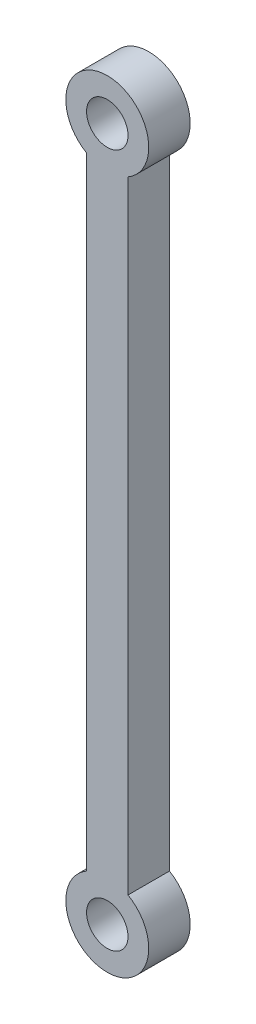
ISO-10303-21;
HEADER;
FILE_DESCRIPTION(('STEP AP214'),'2;1');
FILE_NAME('part.step','',(''),(''),'','','');
FILE_SCHEMA(('AUTOMOTIVE_DESIGN { 1 0 10303 214 1 1 1 1 }'));
ENDSEC;
DATA;
#1=APPLICATION_CONTEXT('core data for automotive mechanical design processes');
#2=APPLICATION_PROTOCOL_DEFINITION('international standard','automotive_design',2000,#1);
#3=PRODUCT_CONTEXT('',#1,'mechanical');
#4=PRODUCT('Part','Part','',(#3));
#5=PRODUCT_RELATED_PRODUCT_CATEGORY('part','',(#4));
#6=PRODUCT_DEFINITION_FORMATION('','',#4);
#7=PRODUCT_DEFINITION_CONTEXT('part definition',#1,'design');
#8=PRODUCT_DEFINITION('design','',#6,#7);
#9=PRODUCT_DEFINITION_SHAPE('','',#8);
#10=(LENGTH_UNIT() NAMED_UNIT(*) SI_UNIT(.MILLI.,.METRE.));
#11=(NAMED_UNIT(*) PLANE_ANGLE_UNIT() SI_UNIT($,.RADIAN.));
#12=(NAMED_UNIT(*) SI_UNIT($,.STERADIAN.) SOLID_ANGLE_UNIT());
#13=UNCERTAINTY_MEASURE_WITH_UNIT(LENGTH_MEASURE(1.E-05),#10,'distance_accuracy_value','');
#14=(GEOMETRIC_REPRESENTATION_CONTEXT(3) GLOBAL_UNCERTAINTY_ASSIGNED_CONTEXT((#13)) GLOBAL_UNIT_ASSIGNED_CONTEXT((#10,
#11,#12)) REPRESENTATION_CONTEXT('',''));
#15=CARTESIAN_POINT('',(0.,0.,0.));
#16=DIRECTION('',(0.,0.,1.));
#17=DIRECTION('',(1.,0.,0.));
#18=AXIS2_PLACEMENT_3D('',#15,#16,#17);
#19=CARTESIAN_POINT('',(1.,-1.73205080756888,2.));
#20=DIRECTION('',(0.,0.,1.));
#21=DIRECTION('',(1.,0.,0.));
#22=AXIS2_PLACEMENT_3D('',#19,#20,#21);
#23=PLANE('',#22);
#24=CARTESIAN_POINT('',(1.,31.7320508075689,2.));
#25=DIRECTION('',(0.,0.,1.));
#26=DIRECTION('',(1.,0.,0.));
#27=AXIS2_PLACEMENT_3D('',#24,#25,#26);
#28=CIRCLE('',#27,1.);
#29=CARTESIAN_POINT('',(2.,31.7320508075689,2.));
#30=VERTEX_POINT('',#29);
#31=EDGE_CURVE('E112',#30,#30,#28,.T.);
#32=ORIENTED_EDGE('',*,*,#31,.F.);
#33=EDGE_LOOP('',(#32));
#34=FACE_BOUND('',#33,.T.);
#35=CARTESIAN_POINT('',(1.,-1.73205080756888,2.));
#36=DIRECTION('',(0.,0.,1.));
#37=DIRECTION('',(1.,0.,0.));
#38=AXIS2_PLACEMENT_3D('',#35,#36,#37);
#39=CIRCLE('',#38,2.);
#40=CARTESIAN_POINT('',(0.,0.,2.));
#41=VERTEX_POINT('',#40);
#42=CARTESIAN_POINT('',(2.,0.,2.));
#43=VERTEX_POINT('',#42);
#44=EDGE_CURVE('E92',#41,#43,#39,.T.);
#45=ORIENTED_EDGE('',*,*,#44,.T.);
#46=DIRECTION('',(0.,1.,0.));
#47=VECTOR('',#46,1.);
#48=CARTESIAN_POINT('',(2.,30.,2.));
#49=LINE('',#48,#47);
#50=CARTESIAN_POINT('',(2.,30.,2.));
#51=VERTEX_POINT('',#50);
#52=EDGE_CURVE('E87',#43,#51,#49,.T.);
#53=ORIENTED_EDGE('',*,*,#52,.T.);
#54=CARTESIAN_POINT('',(1.,31.7320508075689,2.));
#55=DIRECTION('',(0.,0.,1.));
#56=DIRECTION('',(-1.,0.,0.));
#57=AXIS2_PLACEMENT_3D('',#54,#55,#56);
#58=CIRCLE('',#57,2.);
#59=CARTESIAN_POINT('',(0.,30.,2.));
#60=VERTEX_POINT('',#59);
#61=EDGE_CURVE('E90',#51,#60,#58,.T.);
#62=ORIENTED_EDGE('',*,*,#61,.T.);
#63=DIRECTION('',(0.,-1.,0.));
#64=VECTOR('',#63,1.);
#65=CARTESIAN_POINT('',(0.,0.,2.));
#66=LINE('',#65,#64);
#67=EDGE_CURVE('E57',#60,#41,#66,.T.);
#68=ORIENTED_EDGE('',*,*,#67,.T.);
#69=EDGE_LOOP('',(#45,#53,#62,#68));
#70=FACE_BOUND('',#69,.T.);
#71=CARTESIAN_POINT('',(1.,-1.73205080756888,2.));
#72=DIRECTION('',(0.,0.,1.));
#73=DIRECTION('',(1.,0.,0.));
#74=AXIS2_PLACEMENT_3D('',#71,#72,#73);
#75=CIRCLE('',#74,1.);
#76=CARTESIAN_POINT('',(2.,-1.73205080756888,2.));
#77=VERTEX_POINT('',#76);
#78=EDGE_CURVE('E134',#77,#77,#75,.T.);
#79=ORIENTED_EDGE('',*,*,#78,.F.);
#80=EDGE_LOOP('',(#79));
#81=FACE_BOUND('',#80,.T.);
#82=ADVANCED_FACE('F39',(#34,#70,#81),#23,.T.);
#83=CARTESIAN_POINT('',(1.,-1.73205080756888,0.));
#84=DIRECTION('',(0.,0.,1.));
#85=DIRECTION('',(1.,0.,0.));
#86=AXIS2_PLACEMENT_3D('',#83,#84,#85);
#87=PLANE('',#86);
#88=CARTESIAN_POINT('',(1.,-1.73205080756888,0.));
#89=DIRECTION('',(0.,0.,1.));
#90=DIRECTION('',(1.,0.,0.));
#91=AXIS2_PLACEMENT_3D('',#88,#89,#90);
#92=CIRCLE('',#91,2.);
#93=CARTESIAN_POINT('',(0.,0.,0.));
#94=VERTEX_POINT('',#93);
#95=CARTESIAN_POINT('',(2.,0.,0.));
#96=VERTEX_POINT('',#95);
#97=EDGE_CURVE('E108',#94,#96,#92,.T.);
#98=ORIENTED_EDGE('',*,*,#97,.F.);
#99=DIRECTION('',(0.,-1.,0.));
#100=VECTOR('',#99,1.);
#101=CARTESIAN_POINT('',(0.,0.,0.));
#102=LINE('',#101,#100);
#103=CARTESIAN_POINT('',(0.,30.,0.));
#104=VERTEX_POINT('',#103);
#105=EDGE_CURVE('E80',#104,#94,#102,.T.);
#106=ORIENTED_EDGE('',*,*,#105,.F.);
#107=CARTESIAN_POINT('',(1.,31.7320508075689,0.));
#108=DIRECTION('',(0.,0.,1.));
#109=DIRECTION('',(-1.,0.,0.));
#110=AXIS2_PLACEMENT_3D('',#107,#108,#109);
#111=CIRCLE('',#110,2.);
#112=CARTESIAN_POINT('',(2.,30.,0.));
#113=VERTEX_POINT('',#112);
#114=EDGE_CURVE('E74',#113,#104,#111,.T.);
#115=ORIENTED_EDGE('',*,*,#114,.F.);
#116=DIRECTION('',(0.,1.,0.));
#117=VECTOR('',#116,1.);
#118=CARTESIAN_POINT('',(2.,30.,0.));
#119=LINE('',#118,#117);
#120=EDGE_CURVE('E97',#96,#113,#119,.T.);
#121=ORIENTED_EDGE('',*,*,#120,.F.);
#122=EDGE_LOOP('',(#98,#106,#115,#121));
#123=FACE_BOUND('',#122,.T.);
#124=CARTESIAN_POINT('',(1.,31.7320508075689,0.));
#125=DIRECTION('',(0.,0.,1.));
#126=DIRECTION('',(1.,0.,0.));
#127=AXIS2_PLACEMENT_3D('',#124,#125,#126);
#128=CIRCLE('',#127,1.);
#129=CARTESIAN_POINT('',(2.,31.7320508075689,0.));
#130=VERTEX_POINT('',#129);
#131=EDGE_CURVE('E130',#130,#130,#128,.T.);
#132=ORIENTED_EDGE('',*,*,#131,.T.);
#133=EDGE_LOOP('',(#132));
#134=FACE_BOUND('',#133,.T.);
#135=CARTESIAN_POINT('',(1.,-1.73205080756888,0.));
#136=DIRECTION('',(0.,0.,1.));
#137=DIRECTION('',(1.,0.,0.));
#138=AXIS2_PLACEMENT_3D('',#135,#136,#137);
#139=CIRCLE('',#138,1.);
#140=CARTESIAN_POINT('',(2.,-1.73205080756888,0.));
#141=VERTEX_POINT('',#140);
#142=EDGE_CURVE('E138',#141,#141,#139,.T.);
#143=ORIENTED_EDGE('',*,*,#142,.T.);
#144=EDGE_LOOP('',(#143));
#145=FACE_BOUND('',#144,.T.);
#146=ADVANCED_FACE('F125',(#123,#134,#145),#87,.F.);
#147=CARTESIAN_POINT('',(1.,-1.73205080756888,2.));
#148=DIRECTION('',(0.,0.,-1.));
#149=DIRECTION('',(-1.,0.,0.));
#150=AXIS2_PLACEMENT_3D('',#147,#148,#149);
#151=CYLINDRICAL_SURFACE('',#150,2.);
#152=ORIENTED_EDGE('',*,*,#97,.T.);
#153=DIRECTION('',(0.,0.,-1.));
#154=VECTOR('',#153,1.);
#155=CARTESIAN_POINT('',(2.,0.,2.));
#156=LINE('',#155,#154);
#157=EDGE_CURVE('E11',#43,#96,#156,.T.);
#158=ORIENTED_EDGE('',*,*,#157,.F.);
#159=ORIENTED_EDGE('',*,*,#44,.F.);
#160=DIRECTION('',(0.,0.,-1.));
#161=VECTOR('',#160,1.);
#162=CARTESIAN_POINT('',(0.,0.,2.));
#163=LINE('',#162,#161);
#164=EDGE_CURVE('E104',#41,#94,#163,.T.);
#165=ORIENTED_EDGE('',*,*,#164,.T.);
#166=EDGE_LOOP('',(#152,#158,#159,#165));
#167=FACE_BOUND('',#166,.T.);
#168=ADVANCED_FACE('F41',(#167),#151,.T.);
#169=CARTESIAN_POINT('',(2.,30.,2.));
#170=DIRECTION('',(-1.,0.,0.));
#171=DIRECTION('',(0.,-1.,0.));
#172=AXIS2_PLACEMENT_3D('',#169,#170,#171);
#173=PLANE('',#172);
#174=ORIENTED_EDGE('',*,*,#120,.T.);
#175=DIRECTION('',(0.,0.,-1.));
#176=VECTOR('',#175,1.);
#177=CARTESIAN_POINT('',(2.,30.,2.));
#178=LINE('',#177,#176);
#179=EDGE_CURVE('E49',#51,#113,#178,.T.);
#180=ORIENTED_EDGE('',*,*,#179,.F.);
#181=ORIENTED_EDGE('',*,*,#52,.F.);
#182=ORIENTED_EDGE('',*,*,#157,.T.);
#183=EDGE_LOOP('',(#174,#180,#181,#182));
#184=FACE_BOUND('',#183,.T.);
#185=ADVANCED_FACE('F96',(#184),#173,.F.);
#186=CARTESIAN_POINT('',(1.,31.7320508075689,2.));
#187=DIRECTION('',(0.,0.,-1.));
#188=DIRECTION('',(-1.,0.,0.));
#189=AXIS2_PLACEMENT_3D('',#186,#187,#188);
#190=CYLINDRICAL_SURFACE('',#189,2.);
#191=ORIENTED_EDGE('',*,*,#114,.T.);
#192=DIRECTION('',(0.,0.,-1.));
#193=VECTOR('',#192,1.);
#194=CARTESIAN_POINT('',(0.,30.,2.));
#195=LINE('',#194,#193);
#196=EDGE_CURVE('E99',#60,#104,#195,.T.);
#197=ORIENTED_EDGE('',*,*,#196,.F.);
#198=ORIENTED_EDGE('',*,*,#61,.F.);
#199=ORIENTED_EDGE('',*,*,#179,.T.);
#200=EDGE_LOOP('',(#191,#197,#198,#199));
#201=FACE_BOUND('',#200,.T.);
#202=ADVANCED_FACE('F100',(#201),#190,.T.);
#203=CARTESIAN_POINT('',(0.,0.,2.));
#204=DIRECTION('',(1.,0.,0.));
#205=DIRECTION('',(0.,0.,-1.));
#206=AXIS2_PLACEMENT_3D('',#203,#204,#205);
#207=PLANE('',#206);
#208=ORIENTED_EDGE('',*,*,#105,.T.);
#209=ORIENTED_EDGE('',*,*,#164,.F.);
#210=ORIENTED_EDGE('',*,*,#67,.F.);
#211=ORIENTED_EDGE('',*,*,#196,.T.);
#212=EDGE_LOOP('',(#208,#209,#210,#211));
#213=FACE_BOUND('',#212,.T.);
#214=ADVANCED_FACE('F122',(#213),#207,.F.);
#215=CARTESIAN_POINT('',(1.,31.7320508075689,2.));
#216=DIRECTION('',(0.,0.,-1.));
#217=DIRECTION('',(-1.,0.,0.));
#218=AXIS2_PLACEMENT_3D('',#215,#216,#217);
#219=CYLINDRICAL_SURFACE('',#218,1.);
#220=ORIENTED_EDGE('',*,*,#31,.T.);
#221=EDGE_LOOP('',(#220));
#222=FACE_BOUND('',#221,.T.);
#223=ORIENTED_EDGE('',*,*,#131,.F.);
#224=EDGE_LOOP('',(#223));
#225=FACE_BOUND('',#224,.T.);
#226=ADVANCED_FACE('F157',(#222,#225),#219,.F.);
#227=CARTESIAN_POINT('',(1.,-1.73205080756888,2.));
#228=DIRECTION('',(0.,0.,-1.));
#229=DIRECTION('',(-1.,0.,0.));
#230=AXIS2_PLACEMENT_3D('',#227,#228,#229);
#231=CYLINDRICAL_SURFACE('',#230,1.);
#232=ORIENTED_EDGE('',*,*,#78,.T.);
#233=EDGE_LOOP('',(#232));
#234=FACE_BOUND('',#233,.T.);
#235=ORIENTED_EDGE('',*,*,#142,.F.);
#236=EDGE_LOOP('',(#235));
#237=FACE_BOUND('',#236,.T.);
#238=ADVANCED_FACE('F146',(#234,#237),#231,.F.);
#239=CLOSED_SHELL('',(#82,#146,#168,#185,#202,#214,#226,#238));
#240=MANIFOLD_SOLID_BREP('B2',#239);
#241=ADVANCED_BREP_SHAPE_REPRESENTATION('',(#18,#240),#14);
#242=SHAPE_DEFINITION_REPRESENTATION(#9,#241);
ENDSEC;
END-ISO-10303-21;
